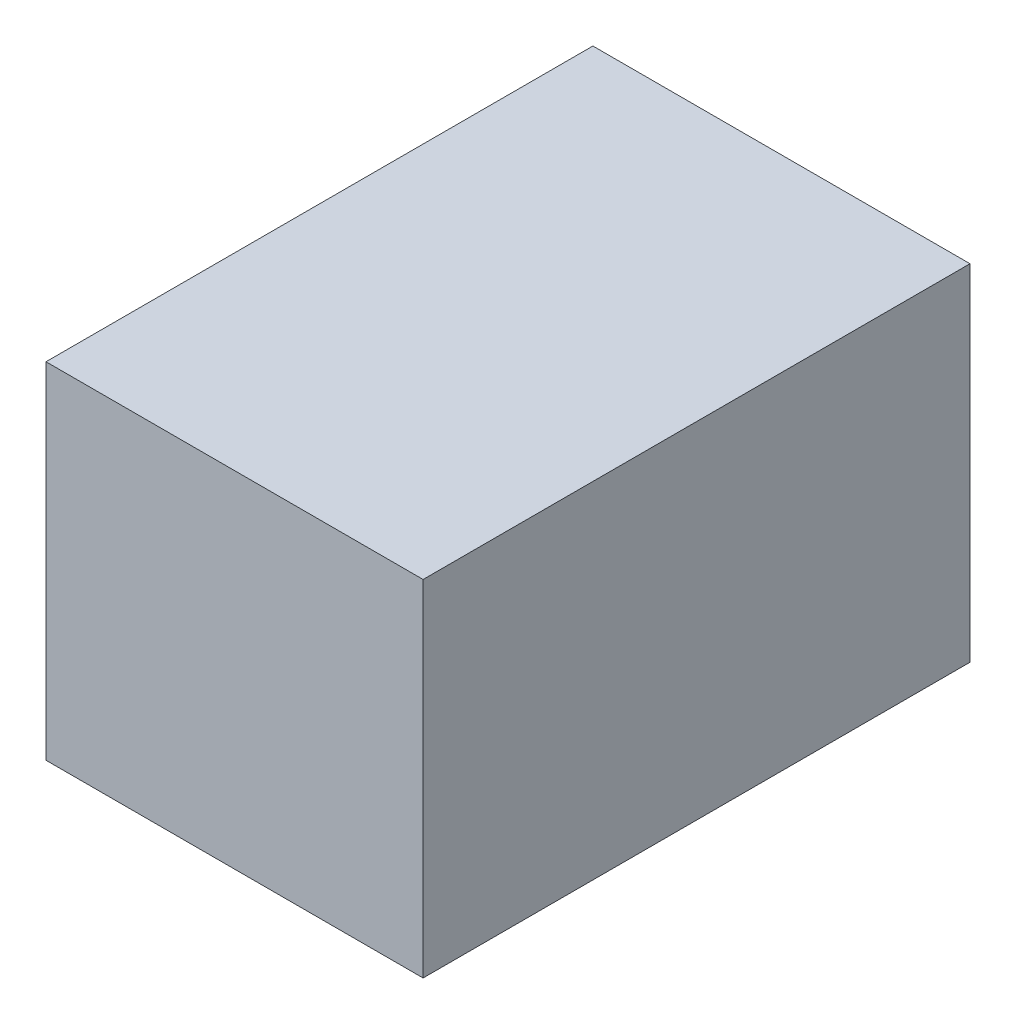
ISO-10303-21;
HEADER;
FILE_DESCRIPTION(('STEP AP214'),'2;1');
FILE_NAME('part.step','',(''),(''),'','','');
FILE_SCHEMA(('AUTOMOTIVE_DESIGN { 1 0 10303 214 1 1 1 1 }'));
ENDSEC;
DATA;
#1=APPLICATION_CONTEXT('core data for automotive mechanical design processes');
#2=APPLICATION_PROTOCOL_DEFINITION('international standard','automotive_design',2000,#1);
#3=PRODUCT_CONTEXT('',#1,'mechanical');
#4=PRODUCT('Part','Part','',(#3));
#5=PRODUCT_RELATED_PRODUCT_CATEGORY('part','',(#4));
#6=PRODUCT_DEFINITION_FORMATION('','',#4);
#7=PRODUCT_DEFINITION_CONTEXT('part definition',#1,'design');
#8=PRODUCT_DEFINITION('design','',#6,#7);
#9=PRODUCT_DEFINITION_SHAPE('','',#8);
#10=(LENGTH_UNIT() NAMED_UNIT(*) SI_UNIT(.MILLI.,.METRE.));
#11=(NAMED_UNIT(*) PLANE_ANGLE_UNIT() SI_UNIT($,.RADIAN.));
#12=(NAMED_UNIT(*) SI_UNIT($,.STERADIAN.) SOLID_ANGLE_UNIT());
#13=UNCERTAINTY_MEASURE_WITH_UNIT(LENGTH_MEASURE(1.E-05),#10,'distance_accuracy_value','');
#14=(GEOMETRIC_REPRESENTATION_CONTEXT(3) GLOBAL_UNCERTAINTY_ASSIGNED_CONTEXT((#13)) GLOBAL_UNIT_ASSIGNED_CONTEXT((#10,
#11,#12)) REPRESENTATION_CONTEXT('',''));
#15=CARTESIAN_POINT('',(0.,0.,0.));
#16=DIRECTION('',(0.,0.,1.));
#17=DIRECTION('',(1.,0.,0.));
#18=AXIS2_PLACEMENT_3D('',#15,#16,#17);
#19=CARTESIAN_POINT('',(-9.924592711473,-7.990745301388,0.));
#20=DIRECTION('',(1.,0.,0.));
#21=DIRECTION('',(0.,1.,0.));
#22=AXIS2_PLACEMENT_3D('',#19,#20,#21);
#23=PLANE('',#22);
#24=DIRECTION('',(0.,-1.,0.));
#25=VECTOR('',#24,1.);
#26=CARTESIAN_POINT('',(-9.924592711473,-7.927634976222,0.));
#27=LINE('',#26,#25);
#28=CARTESIAN_POINT('',(-9.924592711473,-7.927634976222,0.));
#29=VERTEX_POINT('',#28);
#30=CARTESIAN_POINT('',(-9.924592711473,-7.990745301388,0.));
#31=VERTEX_POINT('',#30);
#32=EDGE_CURVE('E11',#29,#31,#27,.T.);
#33=ORIENTED_EDGE('',*,*,#32,.F.);
#34=DIRECTION('',(0.,0.,1.));
#35=VECTOR('',#34,1.);
#36=CARTESIAN_POINT('',(-9.924592711473,-7.927634976222,0.));
#37=LINE('',#36,#35);
#38=CARTESIAN_POINT('',(-9.924592711473,-7.927634976222,0.1));
#39=VERTEX_POINT('',#38);
#40=EDGE_CURVE('E24',#29,#39,#37,.T.);
#41=ORIENTED_EDGE('',*,*,#40,.T.);
#42=DIRECTION('',(0.,1.,0.));
#43=VECTOR('',#42,1.);
#44=CARTESIAN_POINT('',(-9.924592711473,-7.927634976222,0.1));
#45=LINE('',#44,#43);
#46=CARTESIAN_POINT('',(-9.924592711473,-7.990745301388,0.1));
#47=VERTEX_POINT('',#46);
#48=EDGE_CURVE('E75',#47,#39,#45,.T.);
#49=ORIENTED_EDGE('',*,*,#48,.F.);
#50=DIRECTION('',(0.,0.,1.));
#51=VECTOR('',#50,1.);
#52=CARTESIAN_POINT('',(-9.924592711473,-7.990745301388,0.));
#53=LINE('',#52,#51);
#54=EDGE_CURVE('E85',#31,#47,#53,.T.);
#55=ORIENTED_EDGE('',*,*,#54,.F.);
#56=EDGE_LOOP('',(#33,#41,#49,#55));
#57=FACE_BOUND('',#56,.T.);
#58=ADVANCED_FACE('F17',(#57),#23,.T.);
#59=CARTESIAN_POINT('',(-9.993546585265,-7.990745301388,0.));
#60=DIRECTION('',(0.,-1.,0.));
#61=DIRECTION('',(1.,0.,0.));
#62=AXIS2_PLACEMENT_3D('',#59,#60,#61);
#63=PLANE('',#62);
#64=DIRECTION('',(-1.,0.,0.));
#65=VECTOR('',#64,1.);
#66=CARTESIAN_POINT('',(-9.924592711473,-7.990745301388,0.));
#67=LINE('',#66,#65);
#68=CARTESIAN_POINT('',(-9.993546585265,-7.990745301388,0.));
#69=VERTEX_POINT('',#68);
#70=EDGE_CURVE('E83',#31,#69,#67,.T.);
#71=ORIENTED_EDGE('',*,*,#70,.F.);
#72=ORIENTED_EDGE('',*,*,#54,.T.);
#73=DIRECTION('',(1.,0.,0.));
#74=VECTOR('',#73,1.);
#75=CARTESIAN_POINT('',(-9.924592711473,-7.990745301388,0.1));
#76=LINE('',#75,#74);
#77=CARTESIAN_POINT('',(-9.993546585265,-7.990745301388,0.1));
#78=VERTEX_POINT('',#77);
#79=EDGE_CURVE('E81',#78,#47,#76,.T.);
#80=ORIENTED_EDGE('',*,*,#79,.F.);
#81=DIRECTION('',(0.,0.,1.));
#82=VECTOR('',#81,1.);
#83=CARTESIAN_POINT('',(-9.993546585265,-7.990745301388,0.));
#84=LINE('',#83,#82);
#85=EDGE_CURVE('E61',#69,#78,#84,.T.);
#86=ORIENTED_EDGE('',*,*,#85,.F.);
#87=EDGE_LOOP('',(#71,#72,#80,#86));
#88=FACE_BOUND('',#87,.T.);
#89=ADVANCED_FACE('F91',(#88),#63,.T.);
#90=CARTESIAN_POINT('',(-9.993546585265,-7.927634976222,0.));
#91=DIRECTION('',(-1.,0.,0.));
#92=DIRECTION('',(0.,-1.,0.));
#93=AXIS2_PLACEMENT_3D('',#90,#91,#92);
#94=PLANE('',#93);
#95=DIRECTION('',(0.,1.,0.));
#96=VECTOR('',#95,1.);
#97=CARTESIAN_POINT('',(-9.993546585265,-7.990745301388,0.));
#98=LINE('',#97,#96);
#99=CARTESIAN_POINT('',(-9.993546585265,-7.927634976222,0.));
#100=VERTEX_POINT('',#99);
#101=EDGE_CURVE('E65',#69,#100,#98,.T.);
#102=ORIENTED_EDGE('',*,*,#101,.F.);
#103=ORIENTED_EDGE('',*,*,#85,.T.);
#104=DIRECTION('',(0.,-1.,0.));
#105=VECTOR('',#104,1.);
#106=CARTESIAN_POINT('',(-9.993546585265,-7.990745301388,0.1));
#107=LINE('',#106,#105);
#108=CARTESIAN_POINT('',(-9.993546585265,-7.927634976222,0.1));
#109=VERTEX_POINT('',#108);
#110=EDGE_CURVE('E54',#109,#78,#107,.T.);
#111=ORIENTED_EDGE('',*,*,#110,.F.);
#112=DIRECTION('',(0.,0.,1.));
#113=VECTOR('',#112,1.);
#114=CARTESIAN_POINT('',(-9.993546585265,-7.927634976222,0.));
#115=LINE('',#114,#113);
#116=EDGE_CURVE('E58',#100,#109,#115,.T.);
#117=ORIENTED_EDGE('',*,*,#116,.F.);
#118=EDGE_LOOP('',(#102,#103,#111,#117));
#119=FACE_BOUND('',#118,.T.);
#120=ADVANCED_FACE('F57',(#119),#94,.T.);
#121=CARTESIAN_POINT('',(-9.924592711473,-7.927634976222,0.));
#122=DIRECTION('',(0.,1.,0.));
#123=DIRECTION('',(-1.,0.,0.));
#124=AXIS2_PLACEMENT_3D('',#121,#122,#123);
#125=PLANE('',#124);
#126=DIRECTION('',(1.,0.,0.));
#127=VECTOR('',#126,1.);
#128=CARTESIAN_POINT('',(-9.993546585265,-7.927634976222,0.));
#129=LINE('',#128,#127);
#130=EDGE_CURVE('E71',#100,#29,#129,.T.);
#131=ORIENTED_EDGE('',*,*,#130,.F.);
#132=ORIENTED_EDGE('',*,*,#116,.T.);
#133=DIRECTION('',(-1.,0.,0.));
#134=VECTOR('',#133,1.);
#135=CARTESIAN_POINT('',(-9.993546585265,-7.927634976222,0.1));
#136=LINE('',#135,#134);
#137=EDGE_CURVE('E70',#39,#109,#136,.T.);
#138=ORIENTED_EDGE('',*,*,#137,.F.);
#139=ORIENTED_EDGE('',*,*,#40,.F.);
#140=EDGE_LOOP('',(#131,#132,#138,#139));
#141=FACE_BOUND('',#140,.T.);
#142=ADVANCED_FACE('F69',(#141),#125,.T.);
#143=CARTESIAN_POINT('',(-9.959069648369,-7.959190138805,0.));
#144=DIRECTION('',(0.,0.,1.));
#145=DIRECTION('',(1.,0.,0.));
#146=AXIS2_PLACEMENT_3D('',#143,#144,#145);
#147=PLANE('',#146);
#148=ORIENTED_EDGE('',*,*,#130,.T.);
#149=ORIENTED_EDGE('',*,*,#32,.T.);
#150=ORIENTED_EDGE('',*,*,#70,.T.);
#151=ORIENTED_EDGE('',*,*,#101,.T.);
#152=EDGE_LOOP('',(#148,#149,#150,#151));
#153=FACE_BOUND('',#152,.T.);
#154=ADVANCED_FACE('F88',(#153),#147,.F.);
#155=CARTESIAN_POINT('',(-9.959069648369,-7.959190138805,0.1));
#156=DIRECTION('',(0.,0.,1.));
#157=DIRECTION('',(1.,0.,0.));
#158=AXIS2_PLACEMENT_3D('',#155,#156,#157);
#159=PLANE('',#158);
#160=ORIENTED_EDGE('',*,*,#137,.T.);
#161=ORIENTED_EDGE('',*,*,#110,.T.);
#162=ORIENTED_EDGE('',*,*,#79,.T.);
#163=ORIENTED_EDGE('',*,*,#48,.T.);
#164=EDGE_LOOP('',(#160,#161,#162,#163));
#165=FACE_BOUND('',#164,.T.);
#166=ADVANCED_FACE('F74',(#165),#159,.T.);
#167=CLOSED_SHELL('',(#58,#89,#120,#142,#154,#166));
#168=MANIFOLD_SOLID_BREP('B1',#167);
#169=ADVANCED_BREP_SHAPE_REPRESENTATION('',(#18,#168),#14);
#170=SHAPE_DEFINITION_REPRESENTATION(#9,#169);
ENDSEC;
END-ISO-10303-21;
